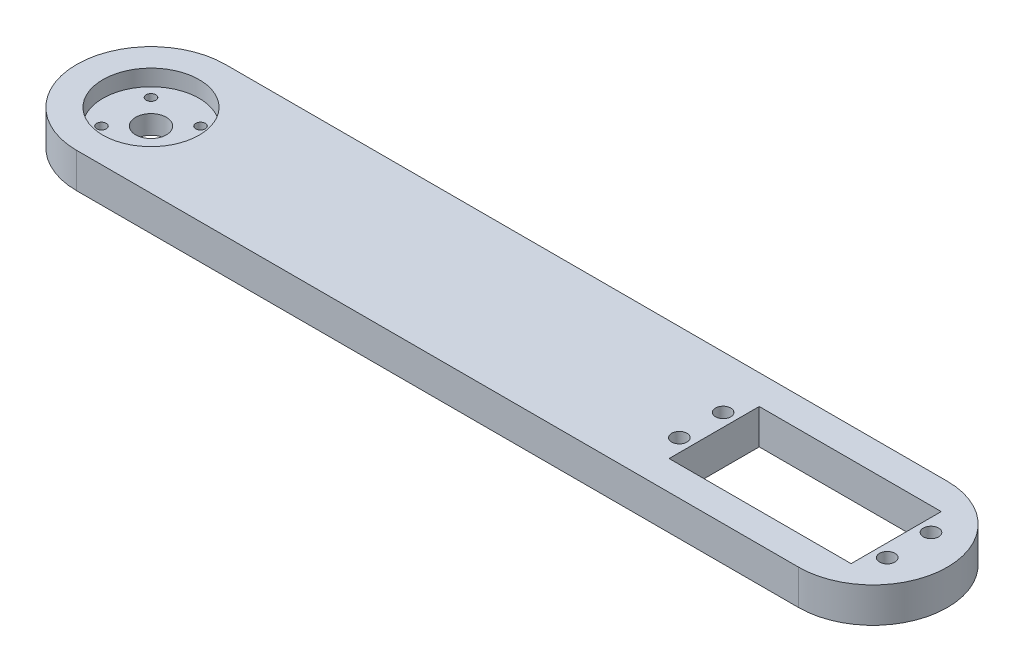
ISO-10303-21;
HEADER;
FILE_DESCRIPTION(('STEP AP214'),'2;1');
FILE_NAME('part.step','',(''),(''),'','','');
FILE_SCHEMA(('AUTOMOTIVE_DESIGN { 1 0 10303 214 1 1 1 1 }'));
ENDSEC;
DATA;
#1=APPLICATION_CONTEXT('core data for automotive mechanical design processes');
#2=APPLICATION_PROTOCOL_DEFINITION('international standard','automotive_design',2000,#1);
#3=PRODUCT_CONTEXT('',#1,'mechanical');
#4=PRODUCT('Part','Part','',(#3));
#5=PRODUCT_RELATED_PRODUCT_CATEGORY('part','',(#4));
#6=PRODUCT_DEFINITION_FORMATION('','',#4);
#7=PRODUCT_DEFINITION_CONTEXT('part definition',#1,'design');
#8=PRODUCT_DEFINITION('design','',#6,#7);
#9=PRODUCT_DEFINITION_SHAPE('','',#8);
#10=(LENGTH_UNIT() NAMED_UNIT(*) SI_UNIT(.MILLI.,.METRE.));
#11=(NAMED_UNIT(*) PLANE_ANGLE_UNIT() SI_UNIT($,.RADIAN.));
#12=(NAMED_UNIT(*) SI_UNIT($,.STERADIAN.) SOLID_ANGLE_UNIT());
#13=UNCERTAINTY_MEASURE_WITH_UNIT(LENGTH_MEASURE(1.E-05),#10,'distance_accuracy_value','');
#14=(GEOMETRIC_REPRESENTATION_CONTEXT(3) GLOBAL_UNCERTAINTY_ASSIGNED_CONTEXT((#13)) GLOBAL_UNIT_ASSIGNED_CONTEXT((#10,
#11,#12)) REPRESENTATION_CONTEXT('',''));
#15=CARTESIAN_POINT('',(0.,0.,0.));
#16=DIRECTION('',(0.,0.,1.));
#17=DIRECTION('',(1.,0.,0.));
#18=AXIS2_PLACEMENT_3D('',#15,#16,#17);
#19=CARTESIAN_POINT('',(0.,8.,0.));
#20=DIRECTION('',(0.,-1.,0.));
#21=DIRECTION('',(0.,0.,-1.));
#22=AXIS2_PLACEMENT_3D('',#19,#20,#21);
#23=CYLINDRICAL_SURFACE('',#22,3.5);
#24=CARTESIAN_POINT('',(0.,-1.20000000006226E-05,0.));
#25=DIRECTION('',(0.,-1.,0.));
#26=DIRECTION('',(0.,0.,-1.));
#27=AXIS2_PLACEMENT_3D('',#24,#25,#26);
#28=CIRCLE('',#27,3.5);
#29=CARTESIAN_POINT('',(0.,-1.20000000006226E-05,-3.5));
#30=VERTEX_POINT('',#29);
#31=EDGE_CURVE('E138',#30,#30,#28,.T.);
#32=ORIENTED_EDGE('',*,*,#31,.T.);
#33=EDGE_LOOP('',(#32));
#34=FACE_BOUND('',#33,.T.);
#35=CARTESIAN_POINT('',(0.,4.3,0.));
#36=DIRECTION('',(0.,1.,0.));
#37=DIRECTION('',(0.,0.,1.));
#38=AXIS2_PLACEMENT_3D('',#35,#36,#37);
#39=CIRCLE('',#38,3.5);
#40=CARTESIAN_POINT('',(0.,4.3,3.5));
#41=VERTEX_POINT('',#40);
#42=EDGE_CURVE('E43',#41,#41,#39,.F.);
#43=ORIENTED_EDGE('',*,*,#42,.F.);
#44=EDGE_LOOP('',(#43));
#45=FACE_BOUND('',#44,.T.);
#46=ADVANCED_FACE('F39',(#34,#45),#23,.F.);
#47=CARTESIAN_POINT('',(0.,0.,0.));
#48=DIRECTION('',(0.,1.,0.));
#49=DIRECTION('',(0.,0.,1.));
#50=AXIS2_PLACEMENT_3D('',#47,#48,#49);
#51=PLANE('',#50);
#52=CARTESIAN_POINT('',(173.25,0.,-5.));
#53=DIRECTION('',(0.,1.,0.));
#54=DIRECTION('',(0.,0.,1.));
#55=AXIS2_PLACEMENT_3D('',#52,#53,#54);
#56=CIRCLE('',#55,1.75000000000001);
#57=CARTESIAN_POINT('',(173.25,0.,-3.24999999999999));
#58=VERTEX_POINT('',#57);
#59=EDGE_CURVE('E271',#58,#58,#56,.T.);
#60=ORIENTED_EDGE('',*,*,#59,.T.);
#61=EDGE_LOOP('',(#60));
#62=FACE_BOUND('',#61,.T.);
#63=CARTESIAN_POINT('',(173.25,0.,4.99999999999999));
#64=DIRECTION('',(0.,1.,0.));
#65=DIRECTION('',(0.,0.,1.));
#66=AXIS2_PLACEMENT_3D('',#63,#64,#65);
#67=CIRCLE('',#66,1.75000000000001);
#68=CARTESIAN_POINT('',(173.25,0.,6.75));
#69=VERTEX_POINT('',#68);
#70=EDGE_CURVE('E290',#69,#69,#67,.T.);
#71=ORIENTED_EDGE('',*,*,#70,.T.);
#72=EDGE_LOOP('',(#71));
#73=FACE_BOUND('',#72,.T.);
#74=CARTESIAN_POINT('',(125.75,0.,5.));
#75=DIRECTION('',(0.,1.,0.));
#76=DIRECTION('',(0.,0.,1.));
#77=AXIS2_PLACEMENT_3D('',#74,#75,#76);
#78=CIRCLE('',#77,1.75000000000001);
#79=CARTESIAN_POINT('',(125.75,0.,6.75000000000001));
#80=VERTEX_POINT('',#79);
#81=EDGE_CURVE('E289',#80,#80,#78,.T.);
#82=ORIENTED_EDGE('',*,*,#81,.T.);
#83=EDGE_LOOP('',(#82));
#84=FACE_BOUND('',#83,.T.);
#85=CARTESIAN_POINT('',(125.75,0.,-5.));
#86=DIRECTION('',(0.,1.,0.));
#87=DIRECTION('',(0.,0.,1.));
#88=AXIS2_PLACEMENT_3D('',#85,#86,#87);
#89=CIRCLE('',#88,1.75000000000001);
#90=CARTESIAN_POINT('',(125.75,0.,-3.24999999999999));
#91=VERTEX_POINT('',#90);
#92=EDGE_CURVE('E291',#91,#91,#89,.T.);
#93=ORIENTED_EDGE('',*,*,#92,.T.);
#94=EDGE_LOOP('',(#93));
#95=FACE_BOUND('',#94,.T.);
#96=CARTESIAN_POINT('',(0.,0.,0.));
#97=DIRECTION('',(0.,1.,0.));
#98=DIRECTION('',(0.,0.,1.));
#99=AXIS2_PLACEMENT_3D('',#96,#97,#98);
#100=CIRCLE('',#99,17.);
#101=CARTESIAN_POINT('',(0.,0.,-17.));
#102=VERTEX_POINT('',#101);
#103=CARTESIAN_POINT('',(0.,0.,17.));
#104=VERTEX_POINT('',#103);
#105=EDGE_CURVE('E129',#102,#104,#100,.T.);
#106=ORIENTED_EDGE('',*,*,#105,.F.);
#107=DIRECTION('',(-1.,0.,0.));
#108=VECTOR('',#107,1.);
#109=CARTESIAN_POINT('',(0.,0.,-17.));
#110=LINE('',#109,#108);
#111=CARTESIAN_POINT('',(165.,0.,-17.));
#112=VERTEX_POINT('',#111);
#113=EDGE_CURVE('E113',#112,#102,#110,.T.);
#114=ORIENTED_EDGE('',*,*,#113,.F.);
#115=CARTESIAN_POINT('',(165.,0.,0.));
#116=DIRECTION('',(0.,1.,0.));
#117=DIRECTION('',(0.,0.,1.));
#118=AXIS2_PLACEMENT_3D('',#115,#116,#117);
#119=CIRCLE('',#118,17.);
#120=CARTESIAN_POINT('',(165.,0.,17.));
#121=VERTEX_POINT('',#120);
#122=EDGE_CURVE('E108',#121,#112,#119,.T.);
#123=ORIENTED_EDGE('',*,*,#122,.F.);
#124=DIRECTION('',(1.,0.,0.));
#125=VECTOR('',#124,1.);
#126=CARTESIAN_POINT('',(0.,0.,17.));
#127=LINE('',#126,#125);
#128=EDGE_CURVE('E132',#104,#121,#127,.T.);
#129=ORIENTED_EDGE('',*,*,#128,.F.);
#130=EDGE_LOOP('',(#106,#114,#123,#129));
#131=FACE_BOUND('',#130,.T.);
#132=DIRECTION('',(0.,0.,-1.));
#133=VECTOR('',#132,1.);
#134=CARTESIAN_POINT('',(128.7,0.,10.3));
#135=LINE('',#134,#133);
#136=CARTESIAN_POINT('',(128.7,0.,10.3));
#137=VERTEX_POINT('',#136);
#138=CARTESIAN_POINT('',(128.7,0.,-10.3));
#139=VERTEX_POINT('',#138);
#140=EDGE_CURVE('E139',#137,#139,#135,.T.);
#141=ORIENTED_EDGE('',*,*,#140,.F.);
#142=DIRECTION('',(-1.,0.,0.));
#143=VECTOR('',#142,1.);
#144=CARTESIAN_POINT('',(128.7,0.,10.3));
#145=LINE('',#144,#143);
#146=CARTESIAN_POINT('',(170.3,0.,10.3));
#147=VERTEX_POINT('',#146);
#148=EDGE_CURVE('E152',#147,#137,#145,.T.);
#149=ORIENTED_EDGE('',*,*,#148,.F.);
#150=DIRECTION('',(0.,0.,1.));
#151=VECTOR('',#150,1.);
#152=CARTESIAN_POINT('',(170.3,0.,10.3));
#153=LINE('',#152,#151);
#154=CARTESIAN_POINT('',(170.3,0.,-10.3));
#155=VERTEX_POINT('',#154);
#156=EDGE_CURVE('E253',#155,#147,#153,.T.);
#157=ORIENTED_EDGE('',*,*,#156,.F.);
#158=DIRECTION('',(1.,0.,0.));
#159=VECTOR('',#158,1.);
#160=CARTESIAN_POINT('',(128.7,0.,-10.3));
#161=LINE('',#160,#159);
#162=EDGE_CURVE('E386',#139,#155,#161,.T.);
#163=ORIENTED_EDGE('',*,*,#162,.F.);
#164=EDGE_LOOP('',(#141,#149,#157,#163));
#165=FACE_BOUND('',#164,.T.);
#166=ORIENTED_EDGE('',*,*,#31,.F.);
#167=EDGE_LOOP('',(#166));
#168=FACE_BOUND('',#167,.T.);
#169=ADVANCED_FACE('F131',(#62,#73,#84,#95,#131,#165,#168),#51,.F.);
#170=CARTESIAN_POINT('',(0.,8.,0.));
#171=DIRECTION('',(0.,-1.,0.));
#172=DIRECTION('',(0.,0.,-1.));
#173=AXIS2_PLACEMENT_3D('',#170,#171,#172);
#174=CYLINDRICAL_SURFACE('',#173,17.);
#175=ORIENTED_EDGE('',*,*,#105,.T.);
#176=DIRECTION('',(0.,-1.,0.));
#177=VECTOR('',#176,1.);
#178=CARTESIAN_POINT('',(0.,8.,17.));
#179=LINE('',#178,#177);
#180=CARTESIAN_POINT('',(0.,8.,17.));
#181=VERTEX_POINT('',#180);
#182=EDGE_CURVE('E11',#181,#104,#179,.T.);
#183=ORIENTED_EDGE('',*,*,#182,.F.);
#184=CARTESIAN_POINT('',(0.,8.,0.));
#185=DIRECTION('',(0.,1.,0.));
#186=DIRECTION('',(0.,0.,1.));
#187=AXIS2_PLACEMENT_3D('',#184,#185,#186);
#188=CIRCLE('',#187,17.);
#189=CARTESIAN_POINT('',(0.,8.,-17.));
#190=VERTEX_POINT('',#189);
#191=EDGE_CURVE('E122',#190,#181,#188,.T.);
#192=ORIENTED_EDGE('',*,*,#191,.F.);
#193=DIRECTION('',(0.,-1.,0.));
#194=VECTOR('',#193,1.);
#195=CARTESIAN_POINT('',(0.,8.,-17.));
#196=LINE('',#195,#194);
#197=EDGE_CURVE('E119',#190,#102,#196,.T.);
#198=ORIENTED_EDGE('',*,*,#197,.T.);
#199=EDGE_LOOP('',(#175,#183,#192,#198));
#200=FACE_BOUND('',#199,.T.);
#201=ADVANCED_FACE('F41',(#200),#174,.T.);
#202=CARTESIAN_POINT('',(0.,8.,17.));
#203=DIRECTION('',(0.,0.,-1.));
#204=DIRECTION('',(-1.,0.,0.));
#205=AXIS2_PLACEMENT_3D('',#202,#203,#204);
#206=PLANE('',#205);
#207=ORIENTED_EDGE('',*,*,#128,.T.);
#208=DIRECTION('',(0.,-1.,0.));
#209=VECTOR('',#208,1.);
#210=CARTESIAN_POINT('',(165.,8.,17.));
#211=LINE('',#210,#209);
#212=CARTESIAN_POINT('',(165.,8.,17.));
#213=VERTEX_POINT('',#212);
#214=EDGE_CURVE('E47',#213,#121,#211,.T.);
#215=ORIENTED_EDGE('',*,*,#214,.F.);
#216=DIRECTION('',(1.,0.,0.));
#217=VECTOR('',#216,1.);
#218=CARTESIAN_POINT('',(0.,8.,17.));
#219=LINE('',#218,#217);
#220=EDGE_CURVE('E213',#181,#213,#219,.T.);
#221=ORIENTED_EDGE('',*,*,#220,.F.);
#222=ORIENTED_EDGE('',*,*,#182,.T.);
#223=EDGE_LOOP('',(#207,#215,#221,#222));
#224=FACE_BOUND('',#223,.T.);
#225=ADVANCED_FACE('F175',(#224),#206,.F.);
#226=CARTESIAN_POINT('',(165.,8.,0.));
#227=DIRECTION('',(0.,-1.,0.));
#228=DIRECTION('',(0.,0.,-1.));
#229=AXIS2_PLACEMENT_3D('',#226,#227,#228);
#230=CYLINDRICAL_SURFACE('',#229,17.);
#231=ORIENTED_EDGE('',*,*,#122,.T.);
#232=DIRECTION('',(0.,-1.,0.));
#233=VECTOR('',#232,1.);
#234=CARTESIAN_POINT('',(165.,8.,-17.));
#235=LINE('',#234,#233);
#236=CARTESIAN_POINT('',(165.,8.,-17.));
#237=VERTEX_POINT('',#236);
#238=EDGE_CURVE('E123',#237,#112,#235,.T.);
#239=ORIENTED_EDGE('',*,*,#238,.F.);
#240=CARTESIAN_POINT('',(165.,8.,0.));
#241=DIRECTION('',(0.,1.,0.));
#242=DIRECTION('',(0.,0.,1.));
#243=AXIS2_PLACEMENT_3D('',#240,#241,#242);
#244=CIRCLE('',#243,17.);
#245=EDGE_CURVE('E212',#213,#237,#244,.T.);
#246=ORIENTED_EDGE('',*,*,#245,.F.);
#247=ORIENTED_EDGE('',*,*,#214,.T.);
#248=EDGE_LOOP('',(#231,#239,#246,#247));
#249=FACE_BOUND('',#248,.T.);
#250=ADVANCED_FACE('F168',(#249),#230,.T.);
#251=CARTESIAN_POINT('',(0.,8.,-17.));
#252=DIRECTION('',(0.,0.,1.));
#253=DIRECTION('',(1.,0.,0.));
#254=AXIS2_PLACEMENT_3D('',#251,#252,#253);
#255=PLANE('',#254);
#256=ORIENTED_EDGE('',*,*,#113,.T.);
#257=ORIENTED_EDGE('',*,*,#197,.F.);
#258=DIRECTION('',(-1.,0.,0.));
#259=VECTOR('',#258,1.);
#260=CARTESIAN_POINT('',(0.,8.,-17.));
#261=LINE('',#260,#259);
#262=EDGE_CURVE('E133',#237,#190,#261,.T.);
#263=ORIENTED_EDGE('',*,*,#262,.F.);
#264=ORIENTED_EDGE('',*,*,#238,.T.);
#265=EDGE_LOOP('',(#256,#257,#263,#264));
#266=FACE_BOUND('',#265,.T.);
#267=ADVANCED_FACE('F120',(#266),#255,.F.);
#268=CARTESIAN_POINT('',(0.,8.,0.));
#269=DIRECTION('',(0.,1.,0.));
#270=DIRECTION('',(0.,0.,1.));
#271=AXIS2_PLACEMENT_3D('',#268,#269,#270);
#272=PLANE('',#271);
#273=CARTESIAN_POINT('',(173.25,8.,-5.));
#274=DIRECTION('',(0.,1.,0.));
#275=DIRECTION('',(0.,0.,-1.));
#276=AXIS2_PLACEMENT_3D('',#273,#274,#275);
#277=CIRCLE('',#276,1.75000000000001);
#278=CARTESIAN_POINT('',(173.25,8.,-6.75000000000001));
#279=VERTEX_POINT('',#278);
#280=EDGE_CURVE('E226',#279,#279,#277,.T.);
#281=ORIENTED_EDGE('',*,*,#280,.F.);
#282=EDGE_LOOP('',(#281));
#283=FACE_BOUND('',#282,.T.);
#284=CARTESIAN_POINT('',(173.25,8.,4.99999999999999));
#285=DIRECTION('',(0.,1.,0.));
#286=DIRECTION('',(0.,0.,1.));
#287=AXIS2_PLACEMENT_3D('',#284,#285,#286);
#288=CIRCLE('',#287,1.75000000000001);
#289=CARTESIAN_POINT('',(173.25,8.,6.75));
#290=VERTEX_POINT('',#289);
#291=EDGE_CURVE('E235',#290,#290,#288,.T.);
#292=ORIENTED_EDGE('',*,*,#291,.F.);
#293=EDGE_LOOP('',(#292));
#294=FACE_BOUND('',#293,.T.);
#295=CARTESIAN_POINT('',(125.75,8.,5.));
#296=DIRECTION('',(0.,1.,0.));
#297=DIRECTION('',(0.,0.,-1.));
#298=AXIS2_PLACEMENT_3D('',#295,#296,#297);
#299=CIRCLE('',#298,1.75000000000001);
#300=CARTESIAN_POINT('',(125.75,8.,3.24999999999999));
#301=VERTEX_POINT('',#300);
#302=EDGE_CURVE('E237',#301,#301,#299,.T.);
#303=ORIENTED_EDGE('',*,*,#302,.F.);
#304=EDGE_LOOP('',(#303));
#305=FACE_BOUND('',#304,.T.);
#306=CARTESIAN_POINT('',(125.75,8.,-5.));
#307=DIRECTION('',(0.,1.,0.));
#308=DIRECTION('',(0.,0.,1.));
#309=AXIS2_PLACEMENT_3D('',#306,#307,#308);
#310=CIRCLE('',#309,1.75000000000001);
#311=CARTESIAN_POINT('',(125.75,8.,-3.24999999999999));
#312=VERTEX_POINT('',#311);
#313=EDGE_CURVE('E238',#312,#312,#310,.T.);
#314=ORIENTED_EDGE('',*,*,#313,.F.);
#315=EDGE_LOOP('',(#314));
#316=FACE_BOUND('',#315,.T.);
#317=CARTESIAN_POINT('',(0.,8.,0.));
#318=DIRECTION('',(0.,1.,0.));
#319=DIRECTION('',(0.,0.,1.));
#320=AXIS2_PLACEMENT_3D('',#317,#318,#319);
#321=CIRCLE('',#320,11.);
#322=CARTESIAN_POINT('',(0.,8.,11.));
#323=VERTEX_POINT('',#322);
#324=EDGE_CURVE('E244',#323,#323,#321,.T.);
#325=ORIENTED_EDGE('',*,*,#324,.F.);
#326=EDGE_LOOP('',(#325));
#327=FACE_BOUND('',#326,.T.);
#328=DIRECTION('',(0.,0.,-1.));
#329=VECTOR('',#328,1.);
#330=CARTESIAN_POINT('',(128.7,8.,10.3));
#331=LINE('',#330,#329);
#332=CARTESIAN_POINT('',(128.7,8.,10.3));
#333=VERTEX_POINT('',#332);
#334=CARTESIAN_POINT('',(128.7,8.,-10.3));
#335=VERTEX_POINT('',#334);
#336=EDGE_CURVE('E246',#333,#335,#331,.T.);
#337=ORIENTED_EDGE('',*,*,#336,.T.);
#338=DIRECTION('',(1.,0.,0.));
#339=VECTOR('',#338,1.);
#340=CARTESIAN_POINT('',(128.7,8.,-10.3));
#341=LINE('',#340,#339);
#342=CARTESIAN_POINT('',(170.3,8.,-10.3));
#343=VERTEX_POINT('',#342);
#344=EDGE_CURVE('E247',#335,#343,#341,.T.);
#345=ORIENTED_EDGE('',*,*,#344,.T.);
#346=DIRECTION('',(0.,0.,1.));
#347=VECTOR('',#346,1.);
#348=CARTESIAN_POINT('',(170.3,8.,10.3));
#349=LINE('',#348,#347);
#350=CARTESIAN_POINT('',(170.3,8.,10.3));
#351=VERTEX_POINT('',#350);
#352=EDGE_CURVE('E59',#343,#351,#349,.T.);
#353=ORIENTED_EDGE('',*,*,#352,.T.);
#354=DIRECTION('',(-1.,0.,0.));
#355=VECTOR('',#354,1.);
#356=CARTESIAN_POINT('',(128.7,8.,10.3));
#357=LINE('',#356,#355);
#358=EDGE_CURVE('E210',#351,#333,#357,.T.);
#359=ORIENTED_EDGE('',*,*,#358,.T.);
#360=EDGE_LOOP('',(#337,#345,#353,#359));
#361=FACE_BOUND('',#360,.T.);
#362=ORIENTED_EDGE('',*,*,#191,.T.);
#363=ORIENTED_EDGE('',*,*,#220,.T.);
#364=ORIENTED_EDGE('',*,*,#245,.T.);
#365=ORIENTED_EDGE('',*,*,#262,.T.);
#366=EDGE_LOOP('',(#362,#363,#364,#365));
#367=FACE_BOUND('',#366,.T.);
#368=ADVANCED_FACE('F167',(#283,#294,#305,#316,#327,#361,#367),#272,.T.);
#369=CARTESIAN_POINT('',(128.7,8.,10.3));
#370=DIRECTION('',(-1.,0.,0.));
#371=DIRECTION('',(0.,0.,1.));
#372=AXIS2_PLACEMENT_3D('',#369,#370,#371);
#373=PLANE('',#372);
#374=DIRECTION('',(0.,-1.,0.));
#375=VECTOR('',#374,1.);
#376=CARTESIAN_POINT('',(128.7,8.,-10.3));
#377=LINE('',#376,#375);
#378=EDGE_CURVE('E83',#335,#139,#377,.T.);
#379=ORIENTED_EDGE('',*,*,#378,.F.);
#380=ORIENTED_EDGE('',*,*,#336,.F.);
#381=DIRECTION('',(0.,-1.,0.));
#382=VECTOR('',#381,1.);
#383=CARTESIAN_POINT('',(128.7,8.,10.3));
#384=LINE('',#383,#382);
#385=EDGE_CURVE('E73',#333,#137,#384,.T.);
#386=ORIENTED_EDGE('',*,*,#385,.T.);
#387=ORIENTED_EDGE('',*,*,#140,.T.);
#388=EDGE_LOOP('',(#379,#380,#386,#387));
#389=FACE_BOUND('',#388,.T.);
#390=ADVANCED_FACE('F193',(#389),#373,.F.);
#391=CARTESIAN_POINT('',(128.7,8.,10.3));
#392=DIRECTION('',(0.,0.,1.));
#393=DIRECTION('',(1.,0.,0.));
#394=AXIS2_PLACEMENT_3D('',#391,#392,#393);
#395=PLANE('',#394);
#396=ORIENTED_EDGE('',*,*,#385,.F.);
#397=ORIENTED_EDGE('',*,*,#358,.F.);
#398=DIRECTION('',(0.,-1.,0.));
#399=VECTOR('',#398,1.);
#400=CARTESIAN_POINT('',(170.3,8.,10.3));
#401=LINE('',#400,#399);
#402=EDGE_CURVE('E202',#351,#147,#401,.T.);
#403=ORIENTED_EDGE('',*,*,#402,.T.);
#404=ORIENTED_EDGE('',*,*,#148,.T.);
#405=EDGE_LOOP('',(#396,#397,#403,#404));
#406=FACE_BOUND('',#405,.T.);
#407=ADVANCED_FACE('F221',(#406),#395,.F.);
#408=CARTESIAN_POINT('',(170.3,8.,10.3));
#409=DIRECTION('',(1.,0.,0.));
#410=DIRECTION('',(0.,0.,-1.));
#411=AXIS2_PLACEMENT_3D('',#408,#409,#410);
#412=PLANE('',#411);
#413=ORIENTED_EDGE('',*,*,#402,.F.);
#414=ORIENTED_EDGE('',*,*,#352,.F.);
#415=DIRECTION('',(0.,-1.,0.));
#416=VECTOR('',#415,1.);
#417=CARTESIAN_POINT('',(170.3,8.,-10.3));
#418=LINE('',#417,#416);
#419=EDGE_CURVE('E208',#343,#155,#418,.T.);
#420=ORIENTED_EDGE('',*,*,#419,.T.);
#421=ORIENTED_EDGE('',*,*,#156,.T.);
#422=EDGE_LOOP('',(#413,#414,#420,#421));
#423=FACE_BOUND('',#422,.T.);
#424=ADVANCED_FACE('F360',(#423),#412,.F.);
#425=CARTESIAN_POINT('',(128.7,8.,-10.3));
#426=DIRECTION('',(0.,0.,-1.));
#427=DIRECTION('',(-1.,0.,0.));
#428=AXIS2_PLACEMENT_3D('',#425,#426,#427);
#429=PLANE('',#428);
#430=ORIENTED_EDGE('',*,*,#419,.F.);
#431=ORIENTED_EDGE('',*,*,#344,.F.);
#432=ORIENTED_EDGE('',*,*,#378,.T.);
#433=ORIENTED_EDGE('',*,*,#162,.T.);
#434=EDGE_LOOP('',(#430,#431,#432,#433));
#435=FACE_BOUND('',#434,.T.);
#436=ADVANCED_FACE('F355',(#435),#429,.F.);
#437=CARTESIAN_POINT('',(0.,4.3,0.));
#438=DIRECTION('',(0.,1.,0.));
#439=DIRECTION('',(0.,0.,1.));
#440=AXIS2_PLACEMENT_3D('',#437,#438,#439);
#441=PLANE('',#440);
#442=CARTESIAN_POINT('',(-5.66000000000006,4.3,5.65999999999994));
#443=DIRECTION('',(0.,1.,0.));
#444=DIRECTION('',(0.,0.,1.));
#445=AXIS2_PLACEMENT_3D('',#442,#443,#444);
#446=CIRCLE('',#445,1.1);
#447=CARTESIAN_POINT('',(-5.66000000000006,4.3,6.75999999999994));
#448=VERTEX_POINT('',#447);
#449=EDGE_CURVE('E269',#448,#448,#446,.T.);
#450=ORIENTED_EDGE('',*,*,#449,.F.);
#451=EDGE_LOOP('',(#450));
#452=FACE_BOUND('',#451,.T.);
#453=CARTESIAN_POINT('',(5.65999999999996,4.3,5.66000000000008));
#454=DIRECTION('',(0.,1.,0.));
#455=DIRECTION('',(0.,0.,1.));
#456=AXIS2_PLACEMENT_3D('',#453,#454,#455);
#457=CIRCLE('',#456,1.09999999999999);
#458=CARTESIAN_POINT('',(5.65999999999996,4.3,6.76000000000007));
#459=VERTEX_POINT('',#458);
#460=EDGE_CURVE('E280',#459,#459,#457,.T.);
#461=ORIENTED_EDGE('',*,*,#460,.F.);
#462=EDGE_LOOP('',(#461));
#463=FACE_BOUND('',#462,.T.);
#464=CARTESIAN_POINT('',(5.66000000000002,4.3,-5.65999999999998));
#465=DIRECTION('',(0.,1.,0.));
#466=DIRECTION('',(0.,0.,1.));
#467=AXIS2_PLACEMENT_3D('',#464,#465,#466);
#468=CIRCLE('',#467,1.1);
#469=CARTESIAN_POINT('',(5.66000000000002,4.3,-4.55999999999998));
#470=VERTEX_POINT('',#469);
#471=EDGE_CURVE('E262',#470,#470,#468,.T.);
#472=ORIENTED_EDGE('',*,*,#471,.F.);
#473=EDGE_LOOP('',(#472));
#474=FACE_BOUND('',#473,.T.);
#475=CARTESIAN_POINT('',(-5.66,4.3,-5.66));
#476=DIRECTION('',(0.,1.,0.));
#477=DIRECTION('',(0.,0.,1.));
#478=AXIS2_PLACEMENT_3D('',#475,#476,#477);
#479=CIRCLE('',#478,1.1);
#480=CARTESIAN_POINT('',(-5.66,4.3,-4.56));
#481=VERTEX_POINT('',#480);
#482=EDGE_CURVE('E261',#481,#481,#479,.T.);
#483=ORIENTED_EDGE('',*,*,#482,.F.);
#484=EDGE_LOOP('',(#483));
#485=FACE_BOUND('',#484,.T.);
#486=CARTESIAN_POINT('',(0.,4.3,0.));
#487=DIRECTION('',(0.,1.,0.));
#488=DIRECTION('',(0.,0.,1.));
#489=AXIS2_PLACEMENT_3D('',#486,#487,#488);
#490=CIRCLE('',#489,11.);
#491=CARTESIAN_POINT('',(0.,4.3,11.));
#492=VERTEX_POINT('',#491);
#493=EDGE_CURVE('E260',#492,#492,#490,.T.);
#494=ORIENTED_EDGE('',*,*,#493,.T.);
#495=EDGE_LOOP('',(#494));
#496=FACE_BOUND('',#495,.T.);
#497=ORIENTED_EDGE('',*,*,#42,.T.);
#498=EDGE_LOOP('',(#497));
#499=FACE_BOUND('',#498,.T.);
#500=ADVANCED_FACE('F348',(#452,#463,#474,#485,#496,#499),#441,.T.);
#501=CARTESIAN_POINT('',(0.,4.3,0.));
#502=DIRECTION('',(0.,1.,0.));
#503=DIRECTION('',(0.,0.,1.));
#504=AXIS2_PLACEMENT_3D('',#501,#502,#503);
#505=CYLINDRICAL_SURFACE('',#504,11.);
#506=ORIENTED_EDGE('',*,*,#493,.F.);
#507=EDGE_LOOP('',(#506));
#508=FACE_BOUND('',#507,.T.);
#509=ORIENTED_EDGE('',*,*,#324,.T.);
#510=EDGE_LOOP('',(#509));
#511=FACE_BOUND('',#510,.T.);
#512=ADVANCED_FACE('F189',(#508,#511),#505,.F.);
#513=CARTESIAN_POINT('',(-5.66,1.3,-5.66));
#514=DIRECTION('',(0.,1.,0.));
#515=DIRECTION('',(0.,0.,1.));
#516=AXIS2_PLACEMENT_3D('',#513,#514,#515);
#517=CYLINDRICAL_SURFACE('',#516,1.1);
#518=CARTESIAN_POINT('',(-5.66,1.3,-5.66));
#519=DIRECTION('',(0.,1.,0.));
#520=DIRECTION('',(0.,0.,1.));
#521=AXIS2_PLACEMENT_3D('',#518,#519,#520);
#522=CIRCLE('',#521,1.1);
#523=CARTESIAN_POINT('',(-5.66,1.3,-4.56));
#524=VERTEX_POINT('',#523);
#525=EDGE_CURVE('E256',#524,#524,#522,.T.);
#526=ORIENTED_EDGE('',*,*,#525,.F.);
#527=EDGE_LOOP('',(#526));
#528=FACE_BOUND('',#527,.T.);
#529=ORIENTED_EDGE('',*,*,#482,.T.);
#530=EDGE_LOOP('',(#529));
#531=FACE_BOUND('',#530,.T.);
#532=ADVANCED_FACE('F347',(#528,#531),#517,.F.);
#533=CARTESIAN_POINT('',(-5.66,1.3,-5.66));
#534=DIRECTION('',(0.,1.,0.));
#535=DIRECTION('',(0.,0.,1.));
#536=AXIS2_PLACEMENT_3D('',#533,#534,#535);
#537=PLANE('',#536);
#538=ORIENTED_EDGE('',*,*,#525,.T.);
#539=EDGE_LOOP('',(#538));
#540=FACE_BOUND('',#539,.T.);
#541=ADVANCED_FACE('F327',(#540),#537,.T.);
#542=CARTESIAN_POINT('',(5.66000000000002,1.3,-5.65999999999998));
#543=DIRECTION('',(0.,1.,0.));
#544=DIRECTION('',(0.,0.,1.));
#545=AXIS2_PLACEMENT_3D('',#542,#543,#544);
#546=CYLINDRICAL_SURFACE('',#545,1.1);
#547=CARTESIAN_POINT('',(5.66000000000002,1.3,-5.65999999999998));
#548=DIRECTION('',(0.,1.,0.));
#549=DIRECTION('',(0.,0.,1.));
#550=AXIS2_PLACEMENT_3D('',#547,#548,#549);
#551=CIRCLE('',#550,1.1);
#552=CARTESIAN_POINT('',(5.66000000000002,1.3,-4.55999999999998));
#553=VERTEX_POINT('',#552);
#554=EDGE_CURVE('E278',#553,#553,#551,.T.);
#555=ORIENTED_EDGE('',*,*,#554,.F.);
#556=EDGE_LOOP('',(#555));
#557=FACE_BOUND('',#556,.T.);
#558=ORIENTED_EDGE('',*,*,#471,.T.);
#559=EDGE_LOOP('',(#558));
#560=FACE_BOUND('',#559,.T.);
#561=ADVANCED_FACE('F322',(#557,#560),#546,.F.);
#562=CARTESIAN_POINT('',(5.66000000000002,1.3,-5.65999999999998));
#563=DIRECTION('',(0.,1.,0.));
#564=DIRECTION('',(0.,0.,1.));
#565=AXIS2_PLACEMENT_3D('',#562,#563,#564);
#566=PLANE('',#565);
#567=ORIENTED_EDGE('',*,*,#554,.T.);
#568=EDGE_LOOP('',(#567));
#569=FACE_BOUND('',#568,.T.);
#570=ADVANCED_FACE('F330',(#569),#566,.T.);
#571=CARTESIAN_POINT('',(5.65999999999996,1.3,5.66000000000008));
#572=DIRECTION('',(0.,1.,0.));
#573=DIRECTION('',(0.,0.,1.));
#574=AXIS2_PLACEMENT_3D('',#571,#572,#573);
#575=CYLINDRICAL_SURFACE('',#574,1.09999999999999);
#576=CARTESIAN_POINT('',(5.65999999999996,1.3,5.66000000000008));
#577=DIRECTION('',(0.,1.,0.));
#578=DIRECTION('',(0.,0.,1.));
#579=AXIS2_PLACEMENT_3D('',#576,#577,#578);
#580=CIRCLE('',#579,1.09999999999999);
#581=CARTESIAN_POINT('',(5.65999999999996,1.3,6.76000000000007));
#582=VERTEX_POINT('',#581);
#583=EDGE_CURVE('E273',#582,#582,#580,.T.);
#584=ORIENTED_EDGE('',*,*,#583,.F.);
#585=EDGE_LOOP('',(#584));
#586=FACE_BOUND('',#585,.T.);
#587=ORIENTED_EDGE('',*,*,#460,.T.);
#588=EDGE_LOOP('',(#587));
#589=FACE_BOUND('',#588,.T.);
#590=ADVANCED_FACE('F335',(#586,#589),#575,.F.);
#591=CARTESIAN_POINT('',(5.65999999999996,1.3,5.66000000000008));
#592=DIRECTION('',(0.,1.,0.));
#593=DIRECTION('',(0.,0.,1.));
#594=AXIS2_PLACEMENT_3D('',#591,#592,#593);
#595=PLANE('',#594);
#596=ORIENTED_EDGE('',*,*,#583,.T.);
#597=EDGE_LOOP('',(#596));
#598=FACE_BOUND('',#597,.T.);
#599=ADVANCED_FACE('F338',(#598),#595,.T.);
#600=CARTESIAN_POINT('',(-5.66000000000006,1.3,5.65999999999994));
#601=DIRECTION('',(0.,1.,0.));
#602=DIRECTION('',(0.,0.,1.));
#603=AXIS2_PLACEMENT_3D('',#600,#601,#602);
#604=CYLINDRICAL_SURFACE('',#603,1.1);
#605=CARTESIAN_POINT('',(-5.66000000000006,1.3,5.65999999999994));
#606=DIRECTION('',(0.,1.,0.));
#607=DIRECTION('',(0.,0.,1.));
#608=AXIS2_PLACEMENT_3D('',#605,#606,#607);
#609=CIRCLE('',#608,1.1);
#610=CARTESIAN_POINT('',(-5.66000000000006,1.3,6.75999999999994));
#611=VERTEX_POINT('',#610);
#612=EDGE_CURVE('E270',#611,#611,#609,.T.);
#613=ORIENTED_EDGE('',*,*,#612,.F.);
#614=EDGE_LOOP('',(#613));
#615=FACE_BOUND('',#614,.T.);
#616=ORIENTED_EDGE('',*,*,#449,.T.);
#617=EDGE_LOOP('',(#616));
#618=FACE_BOUND('',#617,.T.);
#619=ADVANCED_FACE('F320',(#615,#618),#604,.F.);
#620=CARTESIAN_POINT('',(-5.66000000000006,1.3,5.65999999999994));
#621=DIRECTION('',(0.,1.,0.));
#622=DIRECTION('',(0.,0.,1.));
#623=AXIS2_PLACEMENT_3D('',#620,#621,#622);
#624=PLANE('',#623);
#625=ORIENTED_EDGE('',*,*,#612,.T.);
#626=EDGE_LOOP('',(#625));
#627=FACE_BOUND('',#626,.T.);
#628=ADVANCED_FACE('F313',(#627),#624,.T.);
#629=CARTESIAN_POINT('',(125.75,-0.117263518588694,-5.));
#630=DIRECTION('',(0.,1.,0.));
#631=DIRECTION('',(0.,0.,1.));
#632=AXIS2_PLACEMENT_3D('',#629,#630,#631);
#633=CYLINDRICAL_SURFACE('',#632,1.75000000000001);
#634=ORIENTED_EDGE('',*,*,#313,.T.);
#635=EDGE_LOOP('',(#634));
#636=FACE_BOUND('',#635,.T.);
#637=ORIENTED_EDGE('',*,*,#92,.F.);
#638=EDGE_LOOP('',(#637));
#639=FACE_BOUND('',#638,.T.);
#640=ADVANCED_FACE('F302',(#636,#639),#633,.F.);
#641=CARTESIAN_POINT('',(125.75,-0.117263518588694,5.));
#642=DIRECTION('',(0.,1.,0.));
#643=DIRECTION('',(0.,0.,1.));
#644=AXIS2_PLACEMENT_3D('',#641,#642,#643);
#645=CYLINDRICAL_SURFACE('',#644,1.75000000000001);
#646=ORIENTED_EDGE('',*,*,#302,.T.);
#647=EDGE_LOOP('',(#646));
#648=FACE_BOUND('',#647,.T.);
#649=ORIENTED_EDGE('',*,*,#81,.F.);
#650=EDGE_LOOP('',(#649));
#651=FACE_BOUND('',#650,.T.);
#652=ADVANCED_FACE('F297',(#648,#651),#645,.F.);
#653=CARTESIAN_POINT('',(173.25,-0.117263518588694,4.99999999999999));
#654=DIRECTION('',(0.,1.,0.));
#655=DIRECTION('',(0.,0.,1.));
#656=AXIS2_PLACEMENT_3D('',#653,#654,#655);
#657=CYLINDRICAL_SURFACE('',#656,1.75000000000001);
#658=ORIENTED_EDGE('',*,*,#291,.T.);
#659=EDGE_LOOP('',(#658));
#660=FACE_BOUND('',#659,.T.);
#661=ORIENTED_EDGE('',*,*,#70,.F.);
#662=EDGE_LOOP('',(#661));
#663=FACE_BOUND('',#662,.T.);
#664=ADVANCED_FACE('F301',(#660,#663),#657,.F.);
#665=CARTESIAN_POINT('',(173.25,-0.117263518588694,-5.));
#666=DIRECTION('',(0.,1.,0.));
#667=DIRECTION('',(0.,0.,1.));
#668=AXIS2_PLACEMENT_3D('',#665,#666,#667);
#669=CYLINDRICAL_SURFACE('',#668,1.75000000000001);
#670=ORIENTED_EDGE('',*,*,#280,.T.);
#671=EDGE_LOOP('',(#670));
#672=FACE_BOUND('',#671,.T.);
#673=ORIENTED_EDGE('',*,*,#59,.F.);
#674=EDGE_LOOP('',(#673));
#675=FACE_BOUND('',#674,.T.);
#676=ADVANCED_FACE('F325',(#672,#675),#669,.F.);
#677=CLOSED_SHELL('',(#46,#169,#201,#225,#250,#267,#368,#390,#407,#424,#436,#500,#512,#532,#541,
#561,#570,#590,#599,#619,#628,#640,#652,#664,#676));
#678=MANIFOLD_SOLID_BREP('B2',#677);
#679=ADVANCED_BREP_SHAPE_REPRESENTATION('',(#18,#678),#14);
#680=SHAPE_DEFINITION_REPRESENTATION(#9,#679);
ENDSEC;
END-ISO-10303-21;
